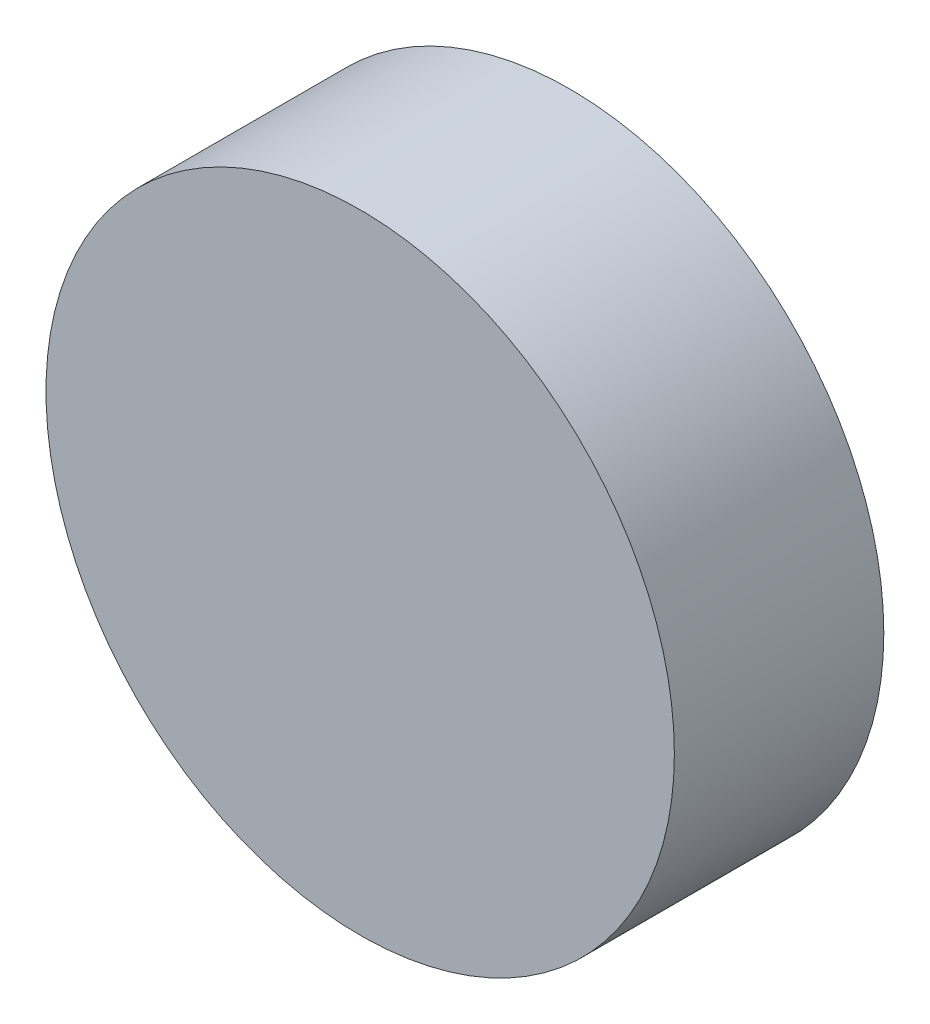
ISO-10303-21;
HEADER;
FILE_DESCRIPTION(('STEP AP214'),'2;1');
FILE_NAME('part.step','',(''),(''),'','','');
FILE_SCHEMA(('AUTOMOTIVE_DESIGN { 1 0 10303 214 1 1 1 1 }'));
ENDSEC;
DATA;
#1=APPLICATION_CONTEXT('core data for automotive mechanical design processes');
#2=APPLICATION_PROTOCOL_DEFINITION('international standard','automotive_design',2000,#1);
#3=PRODUCT_CONTEXT('',#1,'mechanical');
#4=PRODUCT('Part','Part','',(#3));
#5=PRODUCT_RELATED_PRODUCT_CATEGORY('part','',(#4));
#6=PRODUCT_DEFINITION_FORMATION('','',#4);
#7=PRODUCT_DEFINITION_CONTEXT('part definition',#1,'design');
#8=PRODUCT_DEFINITION('design','',#6,#7);
#9=PRODUCT_DEFINITION_SHAPE('','',#8);
#10=(LENGTH_UNIT() NAMED_UNIT(*) SI_UNIT(.MILLI.,.METRE.));
#11=(NAMED_UNIT(*) PLANE_ANGLE_UNIT() SI_UNIT($,.RADIAN.));
#12=(NAMED_UNIT(*) SI_UNIT($,.STERADIAN.) SOLID_ANGLE_UNIT());
#13=UNCERTAINTY_MEASURE_WITH_UNIT(LENGTH_MEASURE(1.E-05),#10,'distance_accuracy_value','');
#14=(GEOMETRIC_REPRESENTATION_CONTEXT(3) GLOBAL_UNCERTAINTY_ASSIGNED_CONTEXT((#13)) GLOBAL_UNIT_ASSIGNED_CONTEXT((#10,
#11,#12)) REPRESENTATION_CONTEXT('',''));
#15=CARTESIAN_POINT('',(0.,0.,0.));
#16=DIRECTION('',(0.,0.,1.));
#17=DIRECTION('',(1.,0.,0.));
#18=AXIS2_PLACEMENT_3D('',#15,#16,#17);
#19=CARTESIAN_POINT('',(12.5,0.,-16.8));
#20=DIRECTION('',(0.,0.,-1.));
#21=DIRECTION('',(-1.,0.,0.));
#22=AXIS2_PLACEMENT_3D('',#19,#20,#21);
#23=CYLINDRICAL_SURFACE('',#22,3.);
#24=CARTESIAN_POINT('',(12.5,0.,-16.8));
#25=DIRECTION('',(0.,0.,1.));
#26=DIRECTION('',(1.,0.,0.));
#27=AXIS2_PLACEMENT_3D('',#24,#25,#26);
#28=CIRCLE('',#27,3.);
#29=CARTESIAN_POINT('',(15.5,0.,-16.8));
#30=VERTEX_POINT('',#29);
#31=EDGE_CURVE('E10',#30,#30,#28,.T.);
#32=ORIENTED_EDGE('',*,*,#31,.F.);
#33=EDGE_LOOP('',(#32));
#34=FACE_BOUND('',#33,.T.);
#35=CARTESIAN_POINT('',(12.5,0.,-18.8));
#36=DIRECTION('',(0.,0.,1.));
#37=DIRECTION('',(1.,0.,0.));
#38=AXIS2_PLACEMENT_3D('',#35,#36,#37);
#39=CIRCLE('',#38,3.);
#40=CARTESIAN_POINT('',(15.5,0.,-18.8));
#41=VERTEX_POINT('',#40);
#42=EDGE_CURVE('E37',#41,#41,#39,.T.);
#43=ORIENTED_EDGE('',*,*,#42,.T.);
#44=EDGE_LOOP('',(#43));
#45=FACE_BOUND('',#44,.T.);
#46=ADVANCED_FACE('F40',(#34,#45),#23,.T.);
#47=CARTESIAN_POINT('',(12.5,0.,-16.8));
#48=DIRECTION('',(0.,0.,1.));
#49=DIRECTION('',(1.,0.,0.));
#50=AXIS2_PLACEMENT_3D('',#47,#48,#49);
#51=PLANE('',#50);
#52=ORIENTED_EDGE('',*,*,#31,.T.);
#53=EDGE_LOOP('',(#52));
#54=FACE_BOUND('',#53,.T.);
#55=ADVANCED_FACE('F55',(#54),#51,.T.);
#56=CARTESIAN_POINT('',(12.5,0.,-18.8));
#57=DIRECTION('',(0.,0.,1.));
#58=DIRECTION('',(1.,0.,0.));
#59=AXIS2_PLACEMENT_3D('',#56,#57,#58);
#60=PLANE('',#59);
#61=ORIENTED_EDGE('',*,*,#42,.F.);
#62=EDGE_LOOP('',(#61));
#63=FACE_BOUND('',#62,.T.);
#64=ADVANCED_FACE('F49',(#63),#60,.F.);
#65=CLOSED_SHELL('',(#46,#55,#64));
#66=MANIFOLD_SOLID_BREP('B2',#65);
#67=ADVANCED_BREP_SHAPE_REPRESENTATION('',(#18,#66),#14);
#68=SHAPE_DEFINITION_REPRESENTATION(#9,#67);
ENDSEC;
END-ISO-10303-21;
